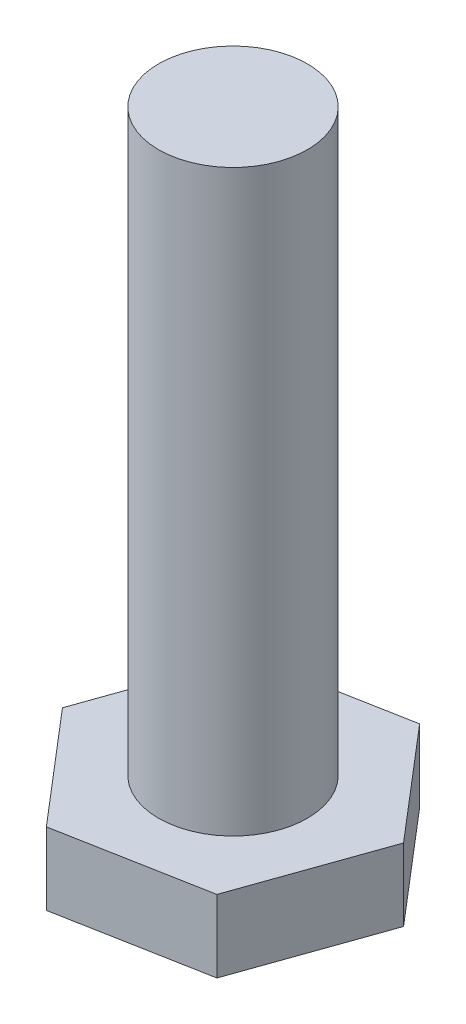
ISO-10303-21;
HEADER;
FILE_DESCRIPTION(('STEP AP214'),'2;1');
FILE_NAME('part.step','',(''),(''),'','','');
FILE_SCHEMA(('AUTOMOTIVE_DESIGN { 1 0 10303 214 1 1 1 1 }'));
ENDSEC;
DATA;
#1=APPLICATION_CONTEXT('core data for automotive mechanical design processes');
#2=APPLICATION_PROTOCOL_DEFINITION('international standard','automotive_design',2000,#1);
#3=PRODUCT_CONTEXT('',#1,'mechanical');
#4=PRODUCT('Part','Part','',(#3));
#5=PRODUCT_RELATED_PRODUCT_CATEGORY('part','',(#4));
#6=PRODUCT_DEFINITION_FORMATION('','',#4);
#7=PRODUCT_DEFINITION_CONTEXT('part definition',#1,'design');
#8=PRODUCT_DEFINITION('design','',#6,#7);
#9=PRODUCT_DEFINITION_SHAPE('','',#8);
#10=(LENGTH_UNIT() NAMED_UNIT(*) SI_UNIT(.MILLI.,.METRE.));
#11=(NAMED_UNIT(*) PLANE_ANGLE_UNIT() SI_UNIT($,.RADIAN.));
#12=(NAMED_UNIT(*) SI_UNIT($,.STERADIAN.) SOLID_ANGLE_UNIT());
#13=UNCERTAINTY_MEASURE_WITH_UNIT(LENGTH_MEASURE(1.E-05),#10,'distance_accuracy_value','');
#14=(GEOMETRIC_REPRESENTATION_CONTEXT(3) GLOBAL_UNCERTAINTY_ASSIGNED_CONTEXT((#13)) GLOBAL_UNIT_ASSIGNED_CONTEXT((#10,
#11,#12)) REPRESENTATION_CONTEXT('',''));
#15=CARTESIAN_POINT('',(0.,0.,0.));
#16=DIRECTION('',(0.,0.,1.));
#17=DIRECTION('',(1.,0.,0.));
#18=AXIS2_PLACEMENT_3D('',#15,#16,#17);
#19=CARTESIAN_POINT('',(6.30755409138971,3.175,-1.17358999123468));
#20=DIRECTION('',(-0.759952521129195,0.,0.649978588593024));
#21=DIRECTION('',(0.649978588593024,0.,0.759952521129195));
#22=AXIS2_PLACEMENT_3D('',#19,#20,#21);
#23=PLANE('',#22);
#24=DIRECTION('',(-0.649978588593024,0.,-0.759952521129195));
#25=VECTOR('',#24,1.);
#26=CARTESIAN_POINT('',(6.30755409138971,0.,-1.17358999123468));
#27=LINE('',#26,#25);
#28=CARTESIAN_POINT('',(6.30755409138971,0.,-1.17358999123468));
#29=VERTEX_POINT('',#28);
#30=CARTESIAN_POINT('',(2.13741829965847,0.,-6.0492970745053));
#31=VERTEX_POINT('',#30);
#32=EDGE_CURVE('E130',#29,#31,#27,.T.);
#33=ORIENTED_EDGE('',*,*,#32,.T.);
#34=DIRECTION('',(0.,-1.,0.));
#35=VECTOR('',#34,1.);
#36=CARTESIAN_POINT('',(2.13741829965847,3.175,-6.0492970745053));
#37=LINE('',#36,#35);
#38=CARTESIAN_POINT('',(2.13741829965847,3.175,-6.0492970745053));
#39=VERTEX_POINT('',#38);
#40=EDGE_CURVE('E42',#39,#31,#37,.T.);
#41=ORIENTED_EDGE('',*,*,#40,.F.);
#42=DIRECTION('',(-0.649978588593024,0.,-0.759952521129195));
#43=VECTOR('',#42,1.);
#44=CARTESIAN_POINT('',(6.30755409138971,3.175,-1.17358999123468));
#45=LINE('',#44,#43);
#46=CARTESIAN_POINT('',(6.30755409138971,3.175,-1.17358999123468));
#47=VERTEX_POINT('',#46);
#48=EDGE_CURVE('E147',#47,#39,#45,.T.);
#49=ORIENTED_EDGE('',*,*,#48,.F.);
#50=DIRECTION('',(0.,-1.,0.));
#51=VECTOR('',#50,1.);
#52=CARTESIAN_POINT('',(6.30755409138971,3.175,-1.17358999123468));
#53=LINE('',#52,#51);
#54=EDGE_CURVE('E126',#47,#29,#53,.T.);
#55=ORIENTED_EDGE('',*,*,#54,.T.);
#56=EDGE_LOOP('',(#33,#41,#49,#55));
#57=FACE_BOUND('',#56,.T.);
#58=ADVANCED_FACE('F39',(#57),#23,.F.);
#59=CARTESIAN_POINT('',(2.13741829965847,3.175,-6.0492970745053));
#60=DIRECTION('',(0.182921709072915,0.,0.983127483264426));
#61=DIRECTION('',(0.983127483264426,0.,-0.182921709072915));
#62=AXIS2_PLACEMENT_3D('',#59,#60,#61);
#63=PLANE('',#62);
#64=DIRECTION('',(-0.983127483264426,0.,0.182921709072915));
#65=VECTOR('',#64,1.);
#66=CARTESIAN_POINT('',(2.13741829965847,0.,-6.0492970745053));
#67=LINE('',#66,#65);
#68=CARTESIAN_POINT('',(-4.17013579173124,0.,-4.87570708327063));
#69=VERTEX_POINT('',#68);
#70=EDGE_CURVE('E134',#31,#69,#67,.T.);
#71=ORIENTED_EDGE('',*,*,#70,.T.);
#72=DIRECTION('',(0.,-1.,0.));
#73=VECTOR('',#72,1.);
#74=CARTESIAN_POINT('',(-4.17013579173124,3.175,-4.87570708327063));
#75=LINE('',#74,#73);
#76=CARTESIAN_POINT('',(-4.17013579173124,3.175,-4.87570708327063));
#77=VERTEX_POINT('',#76);
#78=EDGE_CURVE('E153',#77,#69,#75,.T.);
#79=ORIENTED_EDGE('',*,*,#78,.F.);
#80=DIRECTION('',(-0.983127483264426,0.,0.182921709072915));
#81=VECTOR('',#80,1.);
#82=CARTESIAN_POINT('',(2.13741829965847,3.175,-6.0492970745053));
#83=LINE('',#82,#81);
#84=EDGE_CURVE('E95',#39,#77,#83,.T.);
#85=ORIENTED_EDGE('',*,*,#84,.F.);
#86=ORIENTED_EDGE('',*,*,#40,.T.);
#87=EDGE_LOOP('',(#71,#79,#85,#86));
#88=FACE_BOUND('',#87,.T.);
#89=ADVANCED_FACE('F160',(#88),#63,.F.);
#90=CARTESIAN_POINT('',(-4.17013579173124,3.175,-4.87570708327063));
#91=DIRECTION('',(0.942874230202111,0.,0.333148894671401));
#92=DIRECTION('',(0.333148894671401,0.,-0.942874230202111));
#93=AXIS2_PLACEMENT_3D('',#90,#91,#92);
#94=PLANE('',#93);
#95=DIRECTION('',(-0.333148894671401,0.,0.942874230202111));
#96=VECTOR('',#95,1.);
#97=CARTESIAN_POINT('',(-4.17013579173124,0.,-4.87570708327063));
#98=LINE('',#97,#96);
#99=CARTESIAN_POINT('',(-6.30755409138971,0.,1.17358999123468));
#100=VERTEX_POINT('',#99);
#101=EDGE_CURVE('E138',#69,#100,#98,.T.);
#102=ORIENTED_EDGE('',*,*,#101,.T.);
#103=DIRECTION('',(0.,-1.,0.));
#104=VECTOR('',#103,1.);
#105=CARTESIAN_POINT('',(-6.30755409138971,3.175,1.17358999123468));
#106=LINE('',#105,#104);
#107=CARTESIAN_POINT('',(-6.30755409138971,3.175,1.17358999123468));
#108=VERTEX_POINT('',#107);
#109=EDGE_CURVE('E119',#108,#100,#106,.T.);
#110=ORIENTED_EDGE('',*,*,#109,.F.);
#111=DIRECTION('',(-0.333148894671401,0.,0.942874230202111));
#112=VECTOR('',#111,1.);
#113=CARTESIAN_POINT('',(-4.17013579173124,3.175,-4.87570708327063));
#114=LINE('',#113,#112);
#115=EDGE_CURVE('E108',#77,#108,#114,.T.);
#116=ORIENTED_EDGE('',*,*,#115,.F.);
#117=ORIENTED_EDGE('',*,*,#78,.T.);
#118=EDGE_LOOP('',(#102,#110,#116,#117));
#119=FACE_BOUND('',#118,.T.);
#120=ADVANCED_FACE('F166',(#119),#94,.F.);
#121=CARTESIAN_POINT('',(-6.30755409138971,3.175,1.17358999123468));
#122=DIRECTION('',(0.759952521129195,0.,-0.649978588593024));
#123=DIRECTION('',(-0.649978588593024,0.,-0.759952521129195));
#124=AXIS2_PLACEMENT_3D('',#121,#122,#123);
#125=PLANE('',#124);
#126=DIRECTION('',(0.649978588593024,0.,0.759952521129195));
#127=VECTOR('',#126,1.);
#128=CARTESIAN_POINT('',(-6.30755409138971,0.,1.17358999123468));
#129=LINE('',#128,#127);
#130=CARTESIAN_POINT('',(-2.13741829965846,0.,6.0492970745053));
#131=VERTEX_POINT('',#130);
#132=EDGE_CURVE('E117',#100,#131,#129,.T.);
#133=ORIENTED_EDGE('',*,*,#132,.T.);
#134=DIRECTION('',(0.,-1.,0.));
#135=VECTOR('',#134,1.);
#136=CARTESIAN_POINT('',(-2.13741829965846,3.175,6.0492970745053));
#137=LINE('',#136,#135);
#138=CARTESIAN_POINT('',(-2.13741829965846,3.175,6.0492970745053));
#139=VERTEX_POINT('',#138);
#140=EDGE_CURVE('E114',#139,#131,#137,.T.);
#141=ORIENTED_EDGE('',*,*,#140,.F.);
#142=DIRECTION('',(0.649978588593024,0.,0.759952521129195));
#143=VECTOR('',#142,1.);
#144=CARTESIAN_POINT('',(-6.30755409138971,3.175,1.17358999123468));
#145=LINE('',#144,#143);
#146=EDGE_CURVE('E102',#108,#139,#145,.T.);
#147=ORIENTED_EDGE('',*,*,#146,.F.);
#148=ORIENTED_EDGE('',*,*,#109,.T.);
#149=EDGE_LOOP('',(#133,#141,#147,#148));
#150=FACE_BOUND('',#149,.T.);
#151=ADVANCED_FACE('F115',(#150),#125,.F.);
#152=CARTESIAN_POINT('',(-2.13741829965846,3.175,6.0492970745053));
#153=DIRECTION('',(-0.182921709072915,0.,-0.983127483264426));
#154=DIRECTION('',(-0.983127483264426,0.,0.182921709072915));
#155=AXIS2_PLACEMENT_3D('',#152,#153,#154);
#156=PLANE('',#155);
#157=DIRECTION('',(0.983127483264426,0.,-0.182921709072915));
#158=VECTOR('',#157,1.);
#159=CARTESIAN_POINT('',(-2.13741829965846,0.,6.0492970745053));
#160=LINE('',#159,#158);
#161=CARTESIAN_POINT('',(4.17013579173124,0.,4.87570708327063));
#162=VERTEX_POINT('',#161);
#163=EDGE_CURVE('E80',#131,#162,#160,.T.);
#164=ORIENTED_EDGE('',*,*,#163,.T.);
#165=DIRECTION('',(0.,-1.,0.));
#166=VECTOR('',#165,1.);
#167=CARTESIAN_POINT('',(4.17013579173124,3.175,4.87570708327063));
#168=LINE('',#167,#166);
#169=CARTESIAN_POINT('',(4.17013579173124,3.175,4.87570708327063));
#170=VERTEX_POINT('',#169);
#171=EDGE_CURVE('E120',#170,#162,#168,.T.);
#172=ORIENTED_EDGE('',*,*,#171,.F.);
#173=DIRECTION('',(0.983127483264426,0.,-0.182921709072915));
#174=VECTOR('',#173,1.);
#175=CARTESIAN_POINT('',(-2.13741829965846,3.175,6.0492970745053));
#176=LINE('',#175,#174);
#177=EDGE_CURVE('E106',#139,#170,#176,.T.);
#178=ORIENTED_EDGE('',*,*,#177,.F.);
#179=ORIENTED_EDGE('',*,*,#140,.T.);
#180=EDGE_LOOP('',(#164,#172,#178,#179));
#181=FACE_BOUND('',#180,.T.);
#182=ADVANCED_FACE('F122',(#181),#156,.F.);
#183=CARTESIAN_POINT('',(4.17013579173124,3.175,4.87570708327063));
#184=DIRECTION('',(-0.942874230202111,0.,-0.333148894671402));
#185=DIRECTION('',(-0.333148894671402,0.,0.942874230202111));
#186=AXIS2_PLACEMENT_3D('',#183,#184,#185);
#187=PLANE('',#186);
#188=DIRECTION('',(0.333148894671402,0.,-0.942874230202111));
#189=VECTOR('',#188,1.);
#190=CARTESIAN_POINT('',(4.17013579173124,0.,4.87570708327063));
#191=LINE('',#190,#189);
#192=EDGE_CURVE('E86',#162,#29,#191,.T.);
#193=ORIENTED_EDGE('',*,*,#192,.T.);
#194=ORIENTED_EDGE('',*,*,#54,.F.);
#195=DIRECTION('',(0.333148894671402,0.,-0.942874230202111));
#196=VECTOR('',#195,1.);
#197=CARTESIAN_POINT('',(4.17013579173124,3.175,4.87570708327063));
#198=LINE('',#197,#196);
#199=EDGE_CURVE('E57',#170,#47,#198,.T.);
#200=ORIENTED_EDGE('',*,*,#199,.F.);
#201=ORIENTED_EDGE('',*,*,#171,.T.);
#202=EDGE_LOOP('',(#193,#194,#200,#201));
#203=FACE_BOUND('',#202,.T.);
#204=ADVANCED_FACE('F186',(#203),#187,.F.);
#205=CARTESIAN_POINT('',(0.,3.175,0.));
#206=DIRECTION('',(0.,1.,0.));
#207=DIRECTION('',(0.,0.,1.));
#208=AXIS2_PLACEMENT_3D('',#205,#206,#207);
#209=PLANE('',#208);
#210=CARTESIAN_POINT('',(0.,3.175,0.));
#211=DIRECTION('',(0.,1.,0.));
#212=DIRECTION('',(0.,0.,1.));
#213=AXIS2_PLACEMENT_3D('',#210,#211,#212);
#214=CIRCLE('',#213,3.2639);
#215=CARTESIAN_POINT('',(0.,3.175,3.2639));
#216=VERTEX_POINT('',#215);
#217=EDGE_CURVE('E11',#216,#216,#214,.T.);
#218=ORIENTED_EDGE('',*,*,#217,.F.);
#219=EDGE_LOOP('',(#218));
#220=FACE_BOUND('',#219,.T.);
#221=ORIENTED_EDGE('',*,*,#48,.T.);
#222=ORIENTED_EDGE('',*,*,#84,.T.);
#223=ORIENTED_EDGE('',*,*,#115,.T.);
#224=ORIENTED_EDGE('',*,*,#146,.T.);
#225=ORIENTED_EDGE('',*,*,#177,.T.);
#226=ORIENTED_EDGE('',*,*,#199,.T.);
#227=EDGE_LOOP('',(#221,#222,#223,#224,#225,#226));
#228=FACE_BOUND('',#227,.T.);
#229=ADVANCED_FACE('F104',(#220,#228),#209,.T.);
#230=CARTESIAN_POINT('',(0.,0.,0.));
#231=DIRECTION('',(0.,1.,0.));
#232=DIRECTION('',(0.,0.,1.));
#233=AXIS2_PLACEMENT_3D('',#230,#231,#232);
#234=PLANE('',#233);
#235=ORIENTED_EDGE('',*,*,#32,.F.);
#236=ORIENTED_EDGE('',*,*,#192,.F.);
#237=ORIENTED_EDGE('',*,*,#163,.F.);
#238=ORIENTED_EDGE('',*,*,#132,.F.);
#239=ORIENTED_EDGE('',*,*,#101,.F.);
#240=ORIENTED_EDGE('',*,*,#70,.F.);
#241=EDGE_LOOP('',(#235,#236,#237,#238,#239,#240));
#242=FACE_BOUND('',#241,.T.);
#243=ADVANCED_FACE('F165',(#242),#234,.F.);
#244=CARTESIAN_POINT('',(0.,28.575,0.));
#245=DIRECTION('',(0.,-1.,0.));
#246=DIRECTION('',(0.,0.,-1.));
#247=AXIS2_PLACEMENT_3D('',#244,#245,#246);
#248=CYLINDRICAL_SURFACE('',#247,3.2639);
#249=CARTESIAN_POINT('',(0.,28.575,0.));
#250=DIRECTION('',(0.,1.,0.));
#251=DIRECTION('',(0.,0.,1.));
#252=AXIS2_PLACEMENT_3D('',#249,#250,#251);
#253=CIRCLE('',#252,3.2639);
#254=CARTESIAN_POINT('',(0.,28.575,3.2639));
#255=VERTEX_POINT('',#254);
#256=EDGE_CURVE('E135',#255,#255,#253,.T.);
#257=ORIENTED_EDGE('',*,*,#256,.F.);
#258=EDGE_LOOP('',(#257));
#259=FACE_BOUND('',#258,.T.);
#260=ORIENTED_EDGE('',*,*,#217,.T.);
#261=EDGE_LOOP('',(#260));
#262=FACE_BOUND('',#261,.T.);
#263=ADVANCED_FACE('F179',(#259,#262),#248,.T.);
#264=CARTESIAN_POINT('',(0.,28.575,0.));
#265=DIRECTION('',(0.,1.,0.));
#266=DIRECTION('',(0.,0.,1.));
#267=AXIS2_PLACEMENT_3D('',#264,#265,#266);
#268=PLANE('',#267);
#269=ORIENTED_EDGE('',*,*,#256,.T.);
#270=EDGE_LOOP('',(#269));
#271=FACE_BOUND('',#270,.T.);
#272=ADVANCED_FACE('F177',(#271),#268,.T.);
#273=CLOSED_SHELL('',(#58,#89,#120,#151,#182,#204,#229,#243,#263,#272));
#274=MANIFOLD_SOLID_BREP('B2',#273);
#275=ADVANCED_BREP_SHAPE_REPRESENTATION('',(#18,#274),#14);
#276=SHAPE_DEFINITION_REPRESENTATION(#9,#275);
ENDSEC;
END-ISO-10303-21;
